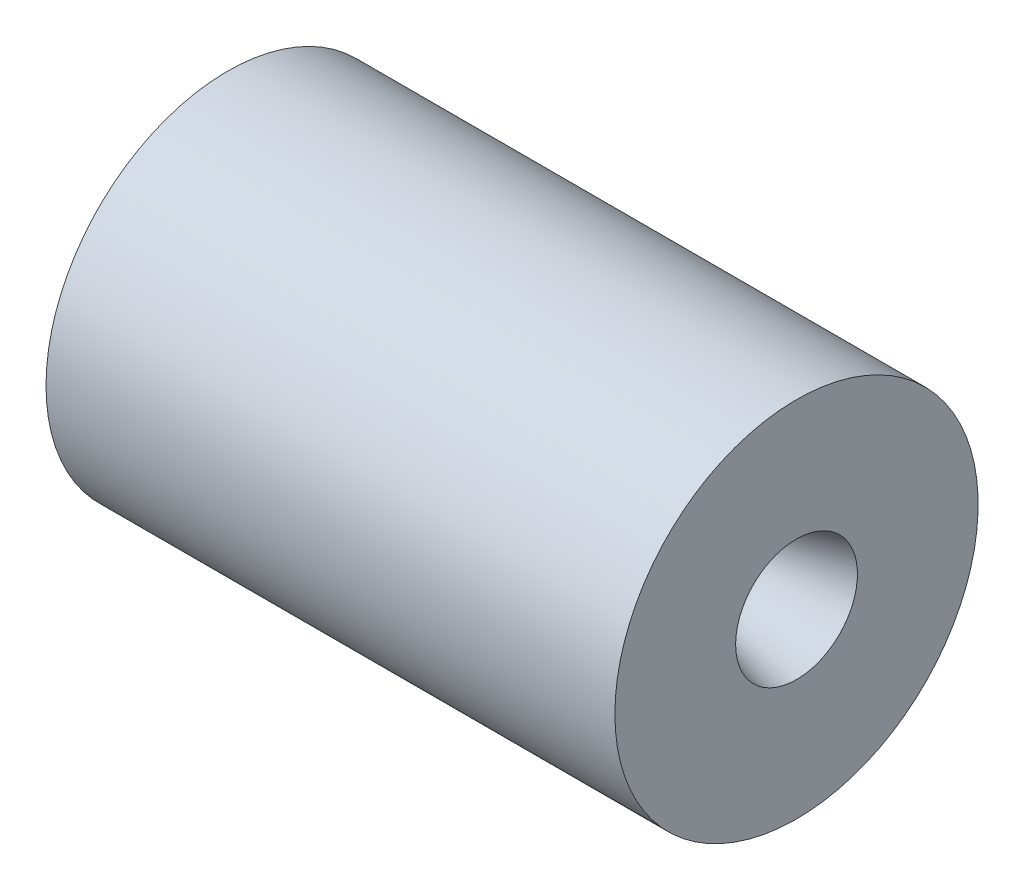
ISO-10303-21;
HEADER;
FILE_DESCRIPTION(('STEP AP214'),'2;1');
FILE_NAME('part.step','',(''),(''),'','','');
FILE_SCHEMA(('AUTOMOTIVE_DESIGN { 1 0 10303 214 1 1 1 1 }'));
ENDSEC;
DATA;
#1=APPLICATION_CONTEXT('core data for automotive mechanical design processes');
#2=APPLICATION_PROTOCOL_DEFINITION('international standard','automotive_design',2000,#1);
#3=PRODUCT_CONTEXT('',#1,'mechanical');
#4=PRODUCT('Part','Part','',(#3));
#5=PRODUCT_RELATED_PRODUCT_CATEGORY('part','',(#4));
#6=PRODUCT_DEFINITION_FORMATION('','',#4);
#7=PRODUCT_DEFINITION_CONTEXT('part definition',#1,'design');
#8=PRODUCT_DEFINITION('design','',#6,#7);
#9=PRODUCT_DEFINITION_SHAPE('','',#8);
#10=(LENGTH_UNIT() NAMED_UNIT(*) SI_UNIT(.MILLI.,.METRE.));
#11=(NAMED_UNIT(*) PLANE_ANGLE_UNIT() SI_UNIT($,.RADIAN.));
#12=(NAMED_UNIT(*) SI_UNIT($,.STERADIAN.) SOLID_ANGLE_UNIT());
#13=UNCERTAINTY_MEASURE_WITH_UNIT(LENGTH_MEASURE(1.E-05),#10,'distance_accuracy_value','');
#14=(GEOMETRIC_REPRESENTATION_CONTEXT(3) GLOBAL_UNCERTAINTY_ASSIGNED_CONTEXT((#13)) GLOBAL_UNIT_ASSIGNED_CONTEXT((#10,
#11,#12)) REPRESENTATION_CONTEXT('',''));
#15=CARTESIAN_POINT('',(0.,0.,0.));
#16=DIRECTION('',(0.,0.,1.));
#17=DIRECTION('',(1.,0.,0.));
#18=AXIS2_PLACEMENT_3D('',#15,#16,#17);
#19=CARTESIAN_POINT('',(18.172025124,24.1554,0.));
#20=DIRECTION('',(-1.,0.,0.));
#21=DIRECTION('',(0.,0.,1.));
#22=AXIS2_PLACEMENT_3D('',#19,#20,#21);
#23=PLANE('',#22);
#24=CARTESIAN_POINT('',(18.172025124,0.,0.));
#25=DIRECTION('',(-1.,0.,0.));
#26=DIRECTION('',(0.,0.,1.));
#27=AXIS2_PLACEMENT_3D('',#24,#25,#26);
#28=CIRCLE('',#27,24.1554);
#29=CARTESIAN_POINT('',(18.172025124,0.,24.1554));
#30=VERTEX_POINT('',#29);
#31=EDGE_CURVE('E10',#30,#30,#28,.T.);
#32=ORIENTED_EDGE('',*,*,#31,.F.);
#33=EDGE_LOOP('',(#32));
#34=FACE_BOUND('',#33,.T.);
#35=CARTESIAN_POINT('',(18.172025124,0.,0.));
#36=DIRECTION('',(-1.,0.,0.));
#37=DIRECTION('',(0.,0.,1.));
#38=AXIS2_PLACEMENT_3D('',#35,#36,#37);
#39=CIRCLE('',#38,8.100703128);
#40=CARTESIAN_POINT('',(18.172025124,0.,8.100703128));
#41=VERTEX_POINT('',#40);
#42=EDGE_CURVE('E76',#41,#41,#39,.T.);
#43=ORIENTED_EDGE('',*,*,#42,.T.);
#44=EDGE_LOOP('',(#43));
#45=FACE_BOUND('',#44,.T.);
#46=ADVANCED_FACE('F37',(#34,#45),#23,.F.);
#47=CARTESIAN_POINT('',(-50.8992562164991,0.,0.));
#48=DIRECTION('',(-1.,0.,0.));
#49=DIRECTION('',(0.,0.,1.));
#50=AXIS2_PLACEMENT_3D('',#47,#48,#49);
#51=CYLINDRICAL_SURFACE('',#50,24.1554);
#52=CARTESIAN_POINT('',(-57.482999588,0.,0.));
#53=DIRECTION('',(-1.,0.,0.));
#54=DIRECTION('',(0.,0.,1.));
#55=AXIS2_PLACEMENT_3D('',#52,#53,#54);
#56=CIRCLE('',#55,24.1554);
#57=CARTESIAN_POINT('',(-57.482999588,0.,24.1554));
#58=VERTEX_POINT('',#57);
#59=EDGE_CURVE('E44',#58,#58,#56,.T.);
#60=ORIENTED_EDGE('',*,*,#59,.F.);
#61=EDGE_LOOP('',(#60));
#62=FACE_BOUND('',#61,.T.);
#63=ORIENTED_EDGE('',*,*,#31,.T.);
#64=EDGE_LOOP('',(#63));
#65=FACE_BOUND('',#64,.T.);
#66=ADVANCED_FACE('F120',(#62,#65),#51,.T.);
#67=CARTESIAN_POINT('',(-57.482999588,19.05,0.));
#68=DIRECTION('',(1.,0.,0.));
#69=DIRECTION('',(0.,0.,-1.));
#70=AXIS2_PLACEMENT_3D('',#67,#68,#69);
#71=PLANE('',#70);
#72=CARTESIAN_POINT('',(-57.482999588,0.,0.));
#73=DIRECTION('',(-1.,0.,0.));
#74=DIRECTION('',(0.,0.,1.));
#75=AXIS2_PLACEMENT_3D('',#72,#73,#74);
#76=CIRCLE('',#75,19.05);
#77=CARTESIAN_POINT('',(-57.482999588,0.,19.05));
#78=VERTEX_POINT('',#77);
#79=EDGE_CURVE('E49',#78,#78,#76,.T.);
#80=ORIENTED_EDGE('',*,*,#79,.F.);
#81=EDGE_LOOP('',(#80));
#82=FACE_BOUND('',#81,.T.);
#83=ORIENTED_EDGE('',*,*,#59,.T.);
#84=EDGE_LOOP('',(#83));
#85=FACE_BOUND('',#84,.T.);
#86=ADVANCED_FACE('F115',(#82,#85),#71,.F.);
#87=CARTESIAN_POINT('',(-50.8992562164991,0.,0.));
#88=DIRECTION('',(-1.,0.,0.));
#89=DIRECTION('',(0.,0.,1.));
#90=AXIS2_PLACEMENT_3D('',#87,#88,#89);
#91=CYLINDRICAL_SURFACE('',#90,19.05);
#92=CARTESIAN_POINT('',(-18.926427282672,0.,0.));
#93=DIRECTION('',(-1.,0.,0.));
#94=DIRECTION('',(0.,0.,1.));
#95=AXIS2_PLACEMENT_3D('',#92,#93,#94);
#96=CIRCLE('',#95,19.05);
#97=CARTESIAN_POINT('',(-18.926427282672,0.,19.05));
#98=VERTEX_POINT('',#97);
#99=EDGE_CURVE('E54',#98,#98,#96,.T.);
#100=ORIENTED_EDGE('',*,*,#99,.F.);
#101=EDGE_LOOP('',(#100));
#102=FACE_BOUND('',#101,.T.);
#103=ORIENTED_EDGE('',*,*,#79,.T.);
#104=EDGE_LOOP('',(#103));
#105=FACE_BOUND('',#104,.T.);
#106=ADVANCED_FACE('F109',(#102,#105),#91,.F.);
#107=CARTESIAN_POINT('',(-18.926427282672,0.,0.));
#108=DIRECTION('',(-1.,0.,0.));
#109=DIRECTION('',(0.,0.,1.));
#110=AXIS2_PLACEMENT_3D('',#107,#108,#109);
#111=TOROIDAL_SURFACE('',#110,9.58788433827671,9.46211566172329);
#112=CARTESIAN_POINT('',(-11.4060018108597,0.,0.));
#113=DIRECTION('',(-1.,0.,0.));
#114=DIRECTION('',(0.,0.,1.));
#115=AXIS2_PLACEMENT_3D('',#112,#113,#114);
#116=CIRCLE('',#115,15.330256106);
#117=CARTESIAN_POINT('',(-11.4060018108597,0.,15.330256106));
#118=VERTEX_POINT('',#117);
#119=EDGE_CURVE('E60',#118,#118,#116,.T.);
#120=ORIENTED_EDGE('',*,*,#119,.F.);
#121=EDGE_LOOP('',(#120));
#122=FACE_BOUND('',#121,.T.);
#123=ORIENTED_EDGE('',*,*,#99,.T.);
#124=EDGE_LOOP('',(#123));
#125=FACE_BOUND('',#124,.T.);
#126=ADVANCED_FACE('F103',(#122,#125),#111,.F.);
#127=CARTESIAN_POINT('',(-11.4060018108597,0.,0.));
#128=DIRECTION('',(-1.,0.,0.));
#129=DIRECTION('',(0.,0.,1.));
#130=AXIS2_PLACEMENT_3D('',#127,#128,#129);
#131=CONICAL_SURFACE('',#130,15.330256106,0.918666794184203);
#132=CARTESIAN_POINT('',(-3.67618648612678,0.,0.));
#133=DIRECTION('',(-1.,0.,0.));
#134=DIRECTION('',(0.,0.,1.));
#135=AXIS2_PLACEMENT_3D('',#132,#133,#134);
#136=CIRCLE('',#135,5.207);
#137=CARTESIAN_POINT('',(-3.67618648612678,0.,5.207));
#138=VERTEX_POINT('',#137);
#139=EDGE_CURVE('E64',#138,#138,#136,.T.);
#140=ORIENTED_EDGE('',*,*,#139,.F.);
#141=EDGE_LOOP('',(#140));
#142=FACE_BOUND('',#141,.T.);
#143=ORIENTED_EDGE('',*,*,#119,.T.);
#144=EDGE_LOOP('',(#143));
#145=FACE_BOUND('',#144,.T.);
#146=ADVANCED_FACE('F97',(#142,#145),#131,.F.);
#147=CARTESIAN_POINT('',(0.0737235257713942,0.,0.));
#148=DIRECTION('',(-1.,0.,0.));
#149=DIRECTION('',(0.,0.,1.));
#150=AXIS2_PLACEMENT_3D('',#147,#148,#149);
#151=TOROIDAL_SURFACE('',#150,8.07031903221929,4.71809505813558);
#152=CARTESIAN_POINT('',(0.,0.,0.));
#153=DIRECTION('',(-1.,0.,0.));
#154=DIRECTION('',(0.,0.,1.));
#155=AXIS2_PLACEMENT_3D('',#152,#153,#154);
#156=CIRCLE('',#155,3.3528);
#157=CARTESIAN_POINT('',(0.,0.,3.3528));
#158=VERTEX_POINT('',#157);
#159=EDGE_CURVE('E68',#158,#158,#156,.T.);
#160=ORIENTED_EDGE('',*,*,#159,.F.);
#161=EDGE_LOOP('',(#160));
#162=FACE_BOUND('',#161,.T.);
#163=ORIENTED_EDGE('',*,*,#139,.T.);
#164=EDGE_LOOP('',(#163));
#165=FACE_BOUND('',#164,.T.);
#166=ADVANCED_FACE('F91',(#162,#165),#151,.T.);
#167=CARTESIAN_POINT('',(0.0468107434867801,0.,0.));
#168=DIRECTION('',(-1.,0.,0.));
#169=DIRECTION('',(0.,0.,1.));
#170=AXIS2_PLACEMENT_3D('',#167,#168,#169);
#171=TOROIDAL_SURFACE('',#170,6.34818812069275,2.99575386827641);
#172=CARTESIAN_POINT('',(0.821750452000003,0.,0.));
#173=DIRECTION('',(-1.,0.,0.));
#174=DIRECTION('',(0.,0.,1.));
#175=AXIS2_PLACEMENT_3D('',#172,#173,#174);
#176=CIRCLE('',#175,3.4544);
#177=CARTESIAN_POINT('',(0.821750452000003,0.,3.4544));
#178=VERTEX_POINT('',#177);
#179=EDGE_CURVE('E72',#178,#178,#176,.T.);
#180=ORIENTED_EDGE('',*,*,#179,.F.);
#181=EDGE_LOOP('',(#180));
#182=FACE_BOUND('',#181,.T.);
#183=ORIENTED_EDGE('',*,*,#159,.T.);
#184=EDGE_LOOP('',(#183));
#185=FACE_BOUND('',#184,.T.);
#186=ADVANCED_FACE('F85',(#182,#185),#171,.T.);
#187=CARTESIAN_POINT('',(0.821750452000003,0.,0.));
#188=DIRECTION('',(1.,0.,0.));
#189=DIRECTION('',(0.,0.,-1.));
#190=AXIS2_PLACEMENT_3D('',#187,#188,#189);
#191=CONICAL_SURFACE('',#190,3.4544,0.261654783176262);
#192=ORIENTED_EDGE('',*,*,#42,.F.);
#193=EDGE_LOOP('',(#192));
#194=FACE_BOUND('',#193,.T.);
#195=ORIENTED_EDGE('',*,*,#179,.T.);
#196=EDGE_LOOP('',(#195));
#197=FACE_BOUND('',#196,.T.);
#198=ADVANCED_FACE('F82',(#194,#197),#191,.F.);
#199=CLOSED_SHELL('',(#46,#66,#86,#106,#126,#146,#166,#186,#198));
#200=MANIFOLD_SOLID_BREP('B2',#199);
#201=ADVANCED_BREP_SHAPE_REPRESENTATION('',(#18,#200),#14);
#202=SHAPE_DEFINITION_REPRESENTATION(#9,#201);
ENDSEC;
END-ISO-10303-21;
